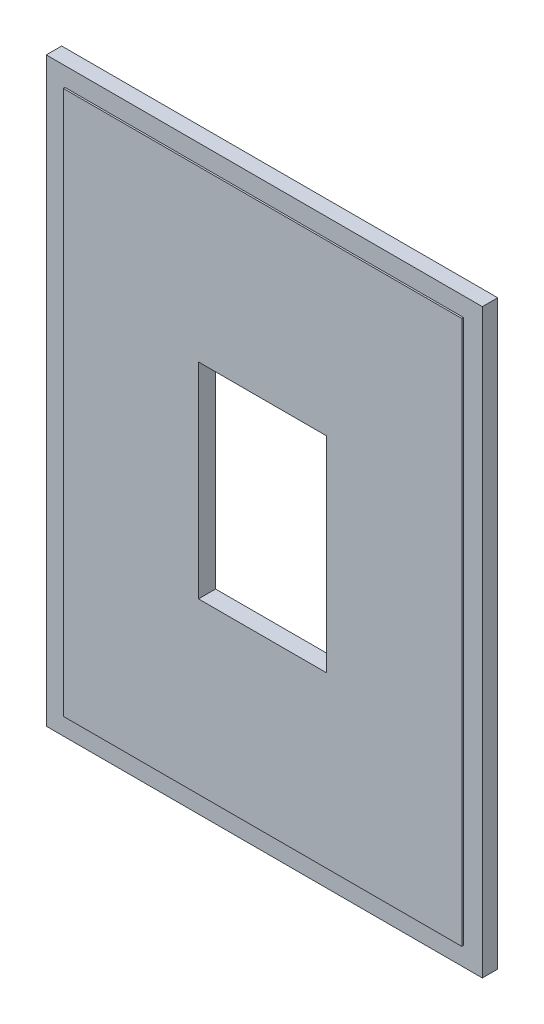
ISO-10303-21;
HEADER;
FILE_DESCRIPTION(('STEP AP214'),'2;1');
FILE_NAME('part.step','',(''),(''),'','','');
FILE_SCHEMA(('AUTOMOTIVE_DESIGN { 1 0 10303 214 1 1 1 1 }'));
ENDSEC;
DATA;
#1=APPLICATION_CONTEXT('core data for automotive mechanical design processes');
#2=APPLICATION_PROTOCOL_DEFINITION('international standard','automotive_design',2000,#1);
#3=PRODUCT_CONTEXT('',#1,'mechanical');
#4=PRODUCT('Part','Part','',(#3));
#5=PRODUCT_RELATED_PRODUCT_CATEGORY('part','',(#4));
#6=PRODUCT_DEFINITION_FORMATION('','',#4);
#7=PRODUCT_DEFINITION_CONTEXT('part definition',#1,'design');
#8=PRODUCT_DEFINITION('design','',#6,#7);
#9=PRODUCT_DEFINITION_SHAPE('','',#8);
#10=(LENGTH_UNIT() NAMED_UNIT(*) SI_UNIT(.MILLI.,.METRE.));
#11=(NAMED_UNIT(*) PLANE_ANGLE_UNIT() SI_UNIT($,.RADIAN.));
#12=(NAMED_UNIT(*) SI_UNIT($,.STERADIAN.) SOLID_ANGLE_UNIT());
#13=UNCERTAINTY_MEASURE_WITH_UNIT(LENGTH_MEASURE(1.E-05),#10,'distance_accuracy_value','');
#14=(GEOMETRIC_REPRESENTATION_CONTEXT(3) GLOBAL_UNCERTAINTY_ASSIGNED_CONTEXT((#13)) GLOBAL_UNIT_ASSIGNED_CONTEXT((#10,
#11,#12)) REPRESENTATION_CONTEXT('',''));
#15=CARTESIAN_POINT('',(0.,0.,0.));
#16=DIRECTION('',(0.,0.,1.));
#17=DIRECTION('',(1.,0.,0.));
#18=AXIS2_PLACEMENT_3D('',#15,#16,#17);
#19=CARTESIAN_POINT('',(127.5,170.,10.));
#20=DIRECTION('',(-1.,0.,0.));
#21=DIRECTION('',(0.,-1.,0.));
#22=AXIS2_PLACEMENT_3D('',#19,#20,#21);
#23=PLANE('',#22);
#24=DIRECTION('',(0.,1.,0.));
#25=VECTOR('',#24,1.);
#26=CARTESIAN_POINT('',(127.5,170.,9.));
#27=LINE('',#26,#25);
#28=CARTESIAN_POINT('',(127.5,-170.,9.));
#29=VERTEX_POINT('',#28);
#30=CARTESIAN_POINT('',(127.5,170.,9.));
#31=VERTEX_POINT('',#30);
#32=EDGE_CURVE('E190',#29,#31,#27,.T.);
#33=ORIENTED_EDGE('',*,*,#32,.F.);
#34=DIRECTION('',(0.,0.,-1.));
#35=VECTOR('',#34,1.);
#36=CARTESIAN_POINT('',(127.5,-170.,10.));
#37=LINE('',#36,#35);
#38=CARTESIAN_POINT('',(127.5,-170.,0.));
#39=VERTEX_POINT('',#38);
#40=EDGE_CURVE('E216',#29,#39,#37,.T.);
#41=ORIENTED_EDGE('',*,*,#40,.T.);
#42=DIRECTION('',(0.,1.,0.));
#43=VECTOR('',#42,1.);
#44=CARTESIAN_POINT('',(127.5,170.,0.));
#45=LINE('',#44,#43);
#46=CARTESIAN_POINT('',(127.5,170.,0.));
#47=VERTEX_POINT('',#46);
#48=EDGE_CURVE('E204',#39,#47,#45,.T.);
#49=ORIENTED_EDGE('',*,*,#48,.T.);
#50=DIRECTION('',(0.,0.,-1.));
#51=VECTOR('',#50,1.);
#52=CARTESIAN_POINT('',(127.5,170.,10.));
#53=LINE('',#52,#51);
#54=EDGE_CURVE('E11',#31,#47,#53,.T.);
#55=ORIENTED_EDGE('',*,*,#54,.F.);
#56=EDGE_LOOP('',(#33,#41,#49,#55));
#57=FACE_BOUND('',#56,.T.);
#58=ADVANCED_FACE('F39',(#57),#23,.F.);
#59=CARTESIAN_POINT('',(-127.5,170.,10.));
#60=DIRECTION('',(0.,-1.,0.));
#61=DIRECTION('',(0.,0.,-1.));
#62=AXIS2_PLACEMENT_3D('',#59,#60,#61);
#63=PLANE('',#62);
#64=DIRECTION('',(-1.,0.,0.));
#65=VECTOR('',#64,1.);
#66=CARTESIAN_POINT('',(-127.5,170.,9.));
#67=LINE('',#66,#65);
#68=CARTESIAN_POINT('',(-127.5,170.,9.));
#69=VERTEX_POINT('',#68);
#70=EDGE_CURVE('E198',#31,#69,#67,.T.);
#71=ORIENTED_EDGE('',*,*,#70,.F.);
#72=ORIENTED_EDGE('',*,*,#54,.T.);
#73=DIRECTION('',(-1.,0.,0.));
#74=VECTOR('',#73,1.);
#75=CARTESIAN_POINT('',(-127.5,170.,0.));
#76=LINE('',#75,#74);
#77=CARTESIAN_POINT('',(-127.5,170.,0.));
#78=VERTEX_POINT('',#77);
#79=EDGE_CURVE('E207',#47,#78,#76,.T.);
#80=ORIENTED_EDGE('',*,*,#79,.T.);
#81=DIRECTION('',(0.,0.,-1.));
#82=VECTOR('',#81,1.);
#83=CARTESIAN_POINT('',(-127.5,170.,10.));
#84=LINE('',#83,#82);
#85=EDGE_CURVE('E46',#69,#78,#84,.T.);
#86=ORIENTED_EDGE('',*,*,#85,.F.);
#87=EDGE_LOOP('',(#71,#72,#80,#86));
#88=FACE_BOUND('',#87,.T.);
#89=ADVANCED_FACE('F229',(#88),#63,.F.);
#90=CARTESIAN_POINT('',(-127.5,170.,10.));
#91=DIRECTION('',(1.,0.,0.));
#92=DIRECTION('',(0.,1.,0.));
#93=AXIS2_PLACEMENT_3D('',#90,#91,#92);
#94=PLANE('',#93);
#95=DIRECTION('',(0.,-1.,0.));
#96=VECTOR('',#95,1.);
#97=CARTESIAN_POINT('',(-127.5,170.,9.));
#98=LINE('',#97,#96);
#99=CARTESIAN_POINT('',(-127.5,-170.,9.));
#100=VERTEX_POINT('',#99);
#101=EDGE_CURVE('E200',#69,#100,#98,.T.);
#102=ORIENTED_EDGE('',*,*,#101,.F.);
#103=ORIENTED_EDGE('',*,*,#85,.T.);
#104=DIRECTION('',(0.,-1.,0.));
#105=VECTOR('',#104,1.);
#106=CARTESIAN_POINT('',(-127.5,170.,0.));
#107=LINE('',#106,#105);
#108=CARTESIAN_POINT('',(-127.5,-170.,0.));
#109=VERTEX_POINT('',#108);
#110=EDGE_CURVE('E210',#78,#109,#107,.T.);
#111=ORIENTED_EDGE('',*,*,#110,.T.);
#112=DIRECTION('',(0.,0.,-1.));
#113=VECTOR('',#112,1.);
#114=CARTESIAN_POINT('',(-127.5,-170.,10.));
#115=LINE('',#114,#113);
#116=EDGE_CURVE('E218',#100,#109,#115,.T.);
#117=ORIENTED_EDGE('',*,*,#116,.F.);
#118=EDGE_LOOP('',(#102,#103,#111,#117));
#119=FACE_BOUND('',#118,.T.);
#120=ADVANCED_FACE('F222',(#119),#94,.F.);
#121=CARTESIAN_POINT('',(-127.5,-170.,10.));
#122=DIRECTION('',(0.,1.,0.));
#123=DIRECTION('',(0.,0.,1.));
#124=AXIS2_PLACEMENT_3D('',#121,#122,#123);
#125=PLANE('',#124);
#126=DIRECTION('',(1.,0.,0.));
#127=VECTOR('',#126,1.);
#128=CARTESIAN_POINT('',(-127.5,-170.,9.));
#129=LINE('',#128,#127);
#130=EDGE_CURVE('E202',#100,#29,#129,.T.);
#131=ORIENTED_EDGE('',*,*,#130,.F.);
#132=ORIENTED_EDGE('',*,*,#116,.T.);
#133=DIRECTION('',(1.,0.,0.));
#134=VECTOR('',#133,1.);
#135=CARTESIAN_POINT('',(-127.5,-170.,0.));
#136=LINE('',#135,#134);
#137=EDGE_CURVE('E213',#109,#39,#136,.T.);
#138=ORIENTED_EDGE('',*,*,#137,.T.);
#139=ORIENTED_EDGE('',*,*,#40,.F.);
#140=EDGE_LOOP('',(#131,#132,#138,#139));
#141=FACE_BOUND('',#140,.T.);
#142=ADVANCED_FACE('F237',(#141),#125,.F.);
#143=CARTESIAN_POINT('',(0.,0.,0.));
#144=DIRECTION('',(0.,0.,1.));
#145=DIRECTION('',(1.,0.,0.));
#146=AXIS2_PLACEMENT_3D('',#143,#144,#145);
#147=PLANE('',#146);
#148=DIRECTION('',(1.,0.,0.));
#149=VECTOR('',#148,1.);
#150=CARTESIAN_POINT('',(0.,-60.,0.));
#151=LINE('',#150,#149);
#152=CARTESIAN_POINT('',(-37.5,-60.,0.));
#153=VERTEX_POINT('',#152);
#154=CARTESIAN_POINT('',(37.5,-60.,0.));
#155=VERTEX_POINT('',#154);
#156=EDGE_CURVE('E157',#153,#155,#151,.T.);
#157=ORIENTED_EDGE('',*,*,#156,.T.);
#158=DIRECTION('',(0.,1.,0.));
#159=VECTOR('',#158,1.);
#160=CARTESIAN_POINT('',(37.5,0.,0.));
#161=LINE('',#160,#159);
#162=CARTESIAN_POINT('',(37.5,60.,0.));
#163=VERTEX_POINT('',#162);
#164=EDGE_CURVE('E160',#155,#163,#161,.T.);
#165=ORIENTED_EDGE('',*,*,#164,.T.);
#166=DIRECTION('',(-1.,0.,0.));
#167=VECTOR('',#166,1.);
#168=CARTESIAN_POINT('',(0.,60.,0.));
#169=LINE('',#168,#167);
#170=CARTESIAN_POINT('',(-37.5,60.,0.));
#171=VERTEX_POINT('',#170);
#172=EDGE_CURVE('E152',#163,#171,#169,.T.);
#173=ORIENTED_EDGE('',*,*,#172,.T.);
#174=DIRECTION('',(0.,-1.,0.));
#175=VECTOR('',#174,1.);
#176=CARTESIAN_POINT('',(-37.5,0.,0.));
#177=LINE('',#176,#175);
#178=EDGE_CURVE('E132',#171,#153,#177,.T.);
#179=ORIENTED_EDGE('',*,*,#178,.T.);
#180=EDGE_LOOP('',(#157,#165,#173,#179));
#181=FACE_BOUND('',#180,.T.);
#182=ORIENTED_EDGE('',*,*,#48,.F.);
#183=ORIENTED_EDGE('',*,*,#137,.F.);
#184=ORIENTED_EDGE('',*,*,#110,.F.);
#185=ORIENTED_EDGE('',*,*,#79,.F.);
#186=EDGE_LOOP('',(#182,#183,#184,#185));
#187=FACE_BOUND('',#186,.T.);
#188=ADVANCED_FACE('F233',(#181,#187),#147,.F.);
#189=CARTESIAN_POINT('',(0.,0.,9.));
#190=DIRECTION('',(0.,0.,1.));
#191=DIRECTION('',(1.,0.,0.));
#192=AXIS2_PLACEMENT_3D('',#189,#190,#191);
#193=PLANE('',#192);
#194=DIRECTION('',(1.,0.,0.));
#195=VECTOR('',#194,1.);
#196=CARTESIAN_POINT('',(-116.5,-159.,9.));
#197=LINE('',#196,#195);
#198=CARTESIAN_POINT('',(-116.5,-159.,9.));
#199=VERTEX_POINT('',#198);
#200=CARTESIAN_POINT('',(116.5,-159.,9.));
#201=VERTEX_POINT('',#200);
#202=EDGE_CURVE('E174',#199,#201,#197,.T.);
#203=ORIENTED_EDGE('',*,*,#202,.F.);
#204=DIRECTION('',(0.,-1.,0.));
#205=VECTOR('',#204,1.);
#206=CARTESIAN_POINT('',(-116.5,159.,9.));
#207=LINE('',#206,#205);
#208=CARTESIAN_POINT('',(-116.5,159.,9.));
#209=VERTEX_POINT('',#208);
#210=EDGE_CURVE('E171',#209,#199,#207,.T.);
#211=ORIENTED_EDGE('',*,*,#210,.F.);
#212=DIRECTION('',(-1.,0.,0.));
#213=VECTOR('',#212,1.);
#214=CARTESIAN_POINT('',(-116.5,159.,9.));
#215=LINE('',#214,#213);
#216=CARTESIAN_POINT('',(116.5,159.,9.));
#217=VERTEX_POINT('',#216);
#218=EDGE_CURVE('E167',#217,#209,#215,.T.);
#219=ORIENTED_EDGE('',*,*,#218,.F.);
#220=DIRECTION('',(0.,1.,0.));
#221=VECTOR('',#220,1.);
#222=CARTESIAN_POINT('',(116.5,159.,9.));
#223=LINE('',#222,#221);
#224=EDGE_CURVE('E164',#201,#217,#223,.T.);
#225=ORIENTED_EDGE('',*,*,#224,.F.);
#226=EDGE_LOOP('',(#203,#211,#219,#225));
#227=FACE_BOUND('',#226,.T.);
#228=ORIENTED_EDGE('',*,*,#32,.T.);
#229=ORIENTED_EDGE('',*,*,#70,.T.);
#230=ORIENTED_EDGE('',*,*,#101,.T.);
#231=ORIENTED_EDGE('',*,*,#130,.T.);
#232=EDGE_LOOP('',(#228,#229,#230,#231));
#233=FACE_BOUND('',#232,.T.);
#234=ADVANCED_FACE('F240',(#227,#233),#193,.T.);
#235=CARTESIAN_POINT('',(116.5,159.,9.));
#236=DIRECTION('',(1.,0.,0.));
#237=DIRECTION('',(0.,0.,-1.));
#238=AXIS2_PLACEMENT_3D('',#235,#236,#237);
#239=PLANE('',#238);
#240=DIRECTION('',(0.,1.,0.));
#241=VECTOR('',#240,1.);
#242=CARTESIAN_POINT('',(116.5,159.,10.));
#243=LINE('',#242,#241);
#244=CARTESIAN_POINT('',(116.5,-159.,10.));
#245=VERTEX_POINT('',#244);
#246=CARTESIAN_POINT('',(116.5,159.,10.));
#247=VERTEX_POINT('',#246);
#248=EDGE_CURVE('E163',#245,#247,#243,.T.);
#249=ORIENTED_EDGE('',*,*,#248,.F.);
#250=DIRECTION('',(0.,0.,1.));
#251=VECTOR('',#250,1.);
#252=CARTESIAN_POINT('',(116.5,-159.,9.));
#253=LINE('',#252,#251);
#254=EDGE_CURVE('E188',#201,#245,#253,.T.);
#255=ORIENTED_EDGE('',*,*,#254,.F.);
#256=ORIENTED_EDGE('',*,*,#224,.T.);
#257=DIRECTION('',(0.,0.,1.));
#258=VECTOR('',#257,1.);
#259=CARTESIAN_POINT('',(116.5,159.,9.));
#260=LINE('',#259,#258);
#261=EDGE_CURVE('E177',#217,#247,#260,.T.);
#262=ORIENTED_EDGE('',*,*,#261,.T.);
#263=EDGE_LOOP('',(#249,#255,#256,#262));
#264=FACE_BOUND('',#263,.T.);
#265=ADVANCED_FACE('F262',(#264),#239,.T.);
#266=CARTESIAN_POINT('',(-116.5,-159.,9.));
#267=DIRECTION('',(0.,-1.,0.));
#268=DIRECTION('',(0.,0.,-1.));
#269=AXIS2_PLACEMENT_3D('',#266,#267,#268);
#270=PLANE('',#269);
#271=DIRECTION('',(1.,0.,0.));
#272=VECTOR('',#271,1.);
#273=CARTESIAN_POINT('',(-116.5,-159.,10.));
#274=LINE('',#273,#272);
#275=CARTESIAN_POINT('',(-116.5,-159.,10.));
#276=VERTEX_POINT('',#275);
#277=EDGE_CURVE('E168',#276,#245,#274,.T.);
#278=ORIENTED_EDGE('',*,*,#277,.F.);
#279=DIRECTION('',(0.,0.,1.));
#280=VECTOR('',#279,1.);
#281=CARTESIAN_POINT('',(-116.5,-159.,9.));
#282=LINE('',#281,#280);
#283=EDGE_CURVE('E191',#199,#276,#282,.T.);
#284=ORIENTED_EDGE('',*,*,#283,.F.);
#285=ORIENTED_EDGE('',*,*,#202,.T.);
#286=ORIENTED_EDGE('',*,*,#254,.T.);
#287=EDGE_LOOP('',(#278,#284,#285,#286));
#288=FACE_BOUND('',#287,.T.);
#289=ADVANCED_FACE('F266',(#288),#270,.T.);
#290=CARTESIAN_POINT('',(-116.5,159.,9.));
#291=DIRECTION('',(-1.,0.,0.));
#292=DIRECTION('',(0.,0.,1.));
#293=AXIS2_PLACEMENT_3D('',#290,#291,#292);
#294=PLANE('',#293);
#295=DIRECTION('',(0.,-1.,0.));
#296=VECTOR('',#295,1.);
#297=CARTESIAN_POINT('',(-116.5,159.,10.));
#298=LINE('',#297,#296);
#299=CARTESIAN_POINT('',(-116.5,159.,10.));
#300=VERTEX_POINT('',#299);
#301=EDGE_CURVE('E183',#300,#276,#298,.T.);
#302=ORIENTED_EDGE('',*,*,#301,.F.);
#303=DIRECTION('',(0.,0.,1.));
#304=VECTOR('',#303,1.);
#305=CARTESIAN_POINT('',(-116.5,159.,9.));
#306=LINE('',#305,#304);
#307=EDGE_CURVE('E193',#209,#300,#306,.T.);
#308=ORIENTED_EDGE('',*,*,#307,.F.);
#309=ORIENTED_EDGE('',*,*,#210,.T.);
#310=ORIENTED_EDGE('',*,*,#283,.T.);
#311=EDGE_LOOP('',(#302,#308,#309,#310));
#312=FACE_BOUND('',#311,.T.);
#313=ADVANCED_FACE('F270',(#312),#294,.T.);
#314=CARTESIAN_POINT('',(-116.5,159.,9.));
#315=DIRECTION('',(0.,1.,0.));
#316=DIRECTION('',(0.,0.,1.));
#317=AXIS2_PLACEMENT_3D('',#314,#315,#316);
#318=PLANE('',#317);
#319=DIRECTION('',(-1.,0.,0.));
#320=VECTOR('',#319,1.);
#321=CARTESIAN_POINT('',(-116.5,159.,10.));
#322=LINE('',#321,#320);
#323=EDGE_CURVE('E180',#247,#300,#322,.T.);
#324=ORIENTED_EDGE('',*,*,#323,.F.);
#325=ORIENTED_EDGE('',*,*,#261,.F.);
#326=ORIENTED_EDGE('',*,*,#218,.T.);
#327=ORIENTED_EDGE('',*,*,#307,.T.);
#328=EDGE_LOOP('',(#324,#325,#326,#327));
#329=FACE_BOUND('',#328,.T.);
#330=ADVANCED_FACE('F259',(#329),#318,.T.);
#331=CARTESIAN_POINT('',(0.,0.,10.));
#332=DIRECTION('',(0.,0.,1.));
#333=DIRECTION('',(1.,0.,0.));
#334=AXIS2_PLACEMENT_3D('',#331,#332,#333);
#335=PLANE('',#334);
#336=DIRECTION('',(0.,1.,0.));
#337=VECTOR('',#336,1.);
#338=CARTESIAN_POINT('',(37.5,60.,10.));
#339=LINE('',#338,#337);
#340=CARTESIAN_POINT('',(37.5,-60.,10.));
#341=VERTEX_POINT('',#340);
#342=CARTESIAN_POINT('',(37.5,60.,10.));
#343=VERTEX_POINT('',#342);
#344=EDGE_CURVE('E61',#341,#343,#339,.T.);
#345=ORIENTED_EDGE('',*,*,#344,.F.);
#346=DIRECTION('',(1.,0.,0.));
#347=VECTOR('',#346,1.);
#348=CARTESIAN_POINT('',(-37.5,-60.,10.));
#349=LINE('',#348,#347);
#350=CARTESIAN_POINT('',(-37.5,-60.,10.));
#351=VERTEX_POINT('',#350);
#352=EDGE_CURVE('E145',#351,#341,#349,.T.);
#353=ORIENTED_EDGE('',*,*,#352,.F.);
#354=DIRECTION('',(0.,-1.,0.));
#355=VECTOR('',#354,1.);
#356=CARTESIAN_POINT('',(-37.5,60.,10.));
#357=LINE('',#356,#355);
#358=CARTESIAN_POINT('',(-37.5,60.,10.));
#359=VERTEX_POINT('',#358);
#360=EDGE_CURVE('E129',#359,#351,#357,.T.);
#361=ORIENTED_EDGE('',*,*,#360,.F.);
#362=DIRECTION('',(-1.,0.,0.));
#363=VECTOR('',#362,1.);
#364=CARTESIAN_POINT('',(-37.5,60.,10.));
#365=LINE('',#364,#363);
#366=EDGE_CURVE('E138',#343,#359,#365,.T.);
#367=ORIENTED_EDGE('',*,*,#366,.F.);
#368=EDGE_LOOP('',(#345,#353,#361,#367));
#369=FACE_BOUND('',#368,.T.);
#370=ORIENTED_EDGE('',*,*,#277,.T.);
#371=ORIENTED_EDGE('',*,*,#248,.T.);
#372=ORIENTED_EDGE('',*,*,#323,.T.);
#373=ORIENTED_EDGE('',*,*,#301,.T.);
#374=EDGE_LOOP('',(#370,#371,#372,#373));
#375=FACE_BOUND('',#374,.T.);
#376=ADVANCED_FACE('F142',(#369,#375),#335,.T.);
#377=CARTESIAN_POINT('',(37.5,60.,-10.));
#378=DIRECTION('',(1.,0.,0.));
#379=DIRECTION('',(0.,1.,0.));
#380=AXIS2_PLACEMENT_3D('',#377,#378,#379);
#381=PLANE('',#380);
#382=DIRECTION('',(0.,0.,1.));
#383=VECTOR('',#382,1.);
#384=CARTESIAN_POINT('',(37.5,-60.,-10.));
#385=LINE('',#384,#383);
#386=EDGE_CURVE('E150',#155,#341,#385,.T.);
#387=ORIENTED_EDGE('',*,*,#386,.T.);
#388=ORIENTED_EDGE('',*,*,#344,.T.);
#389=DIRECTION('',(0.,0.,1.));
#390=VECTOR('',#389,1.);
#391=CARTESIAN_POINT('',(37.5,60.,-10.));
#392=LINE('',#391,#390);
#393=EDGE_CURVE('E135',#163,#343,#392,.T.);
#394=ORIENTED_EDGE('',*,*,#393,.F.);
#395=ORIENTED_EDGE('',*,*,#164,.F.);
#396=EDGE_LOOP('',(#387,#388,#394,#395));
#397=FACE_BOUND('',#396,.T.);
#398=ADVANCED_FACE('F258',(#397),#381,.F.);
#399=CARTESIAN_POINT('',(-37.5,-60.,-10.));
#400=DIRECTION('',(0.,-1.,0.));
#401=DIRECTION('',(0.,0.,-1.));
#402=AXIS2_PLACEMENT_3D('',#399,#400,#401);
#403=PLANE('',#402);
#404=DIRECTION('',(0.,0.,1.));
#405=VECTOR('',#404,1.);
#406=CARTESIAN_POINT('',(-37.5,-60.,-10.));
#407=LINE('',#406,#405);
#408=EDGE_CURVE('E134',#153,#351,#407,.T.);
#409=ORIENTED_EDGE('',*,*,#408,.T.);
#410=ORIENTED_EDGE('',*,*,#352,.T.);
#411=ORIENTED_EDGE('',*,*,#386,.F.);
#412=ORIENTED_EDGE('',*,*,#156,.F.);
#413=EDGE_LOOP('',(#409,#410,#411,#412));
#414=FACE_BOUND('',#413,.T.);
#415=ADVANCED_FACE('F280',(#414),#403,.F.);
#416=CARTESIAN_POINT('',(-37.5,60.,-10.));
#417=DIRECTION('',(-1.,0.,0.));
#418=DIRECTION('',(0.,-1.,0.));
#419=AXIS2_PLACEMENT_3D('',#416,#417,#418);
#420=PLANE('',#419);
#421=DIRECTION('',(0.,0.,1.));
#422=VECTOR('',#421,1.);
#423=CARTESIAN_POINT('',(-37.5,60.,-10.));
#424=LINE('',#423,#422);
#425=EDGE_CURVE('E53',#171,#359,#424,.T.);
#426=ORIENTED_EDGE('',*,*,#425,.T.);
#427=ORIENTED_EDGE('',*,*,#360,.T.);
#428=ORIENTED_EDGE('',*,*,#408,.F.);
#429=ORIENTED_EDGE('',*,*,#178,.F.);
#430=EDGE_LOOP('',(#426,#427,#428,#429));
#431=FACE_BOUND('',#430,.T.);
#432=ADVANCED_FACE('F126',(#431),#420,.F.);
#433=CARTESIAN_POINT('',(-37.5,60.,-10.));
#434=DIRECTION('',(0.,1.,0.));
#435=DIRECTION('',(0.,0.,1.));
#436=AXIS2_PLACEMENT_3D('',#433,#434,#435);
#437=PLANE('',#436);
#438=ORIENTED_EDGE('',*,*,#393,.T.);
#439=ORIENTED_EDGE('',*,*,#366,.T.);
#440=ORIENTED_EDGE('',*,*,#425,.F.);
#441=ORIENTED_EDGE('',*,*,#172,.F.);
#442=EDGE_LOOP('',(#438,#439,#440,#441));
#443=FACE_BOUND('',#442,.T.);
#444=ADVANCED_FACE('F139',(#443),#437,.F.);
#445=CLOSED_SHELL('',(#58,#89,#120,#142,#188,#234,#265,#289,#313,#330,#376,#398,#415,#432,#444));
#446=MANIFOLD_SOLID_BREP('B2',#445);
#447=ADVANCED_BREP_SHAPE_REPRESENTATION('',(#18,#446),#14);
#448=SHAPE_DEFINITION_REPRESENTATION(#9,#447);
ENDSEC;
END-ISO-10303-21;
